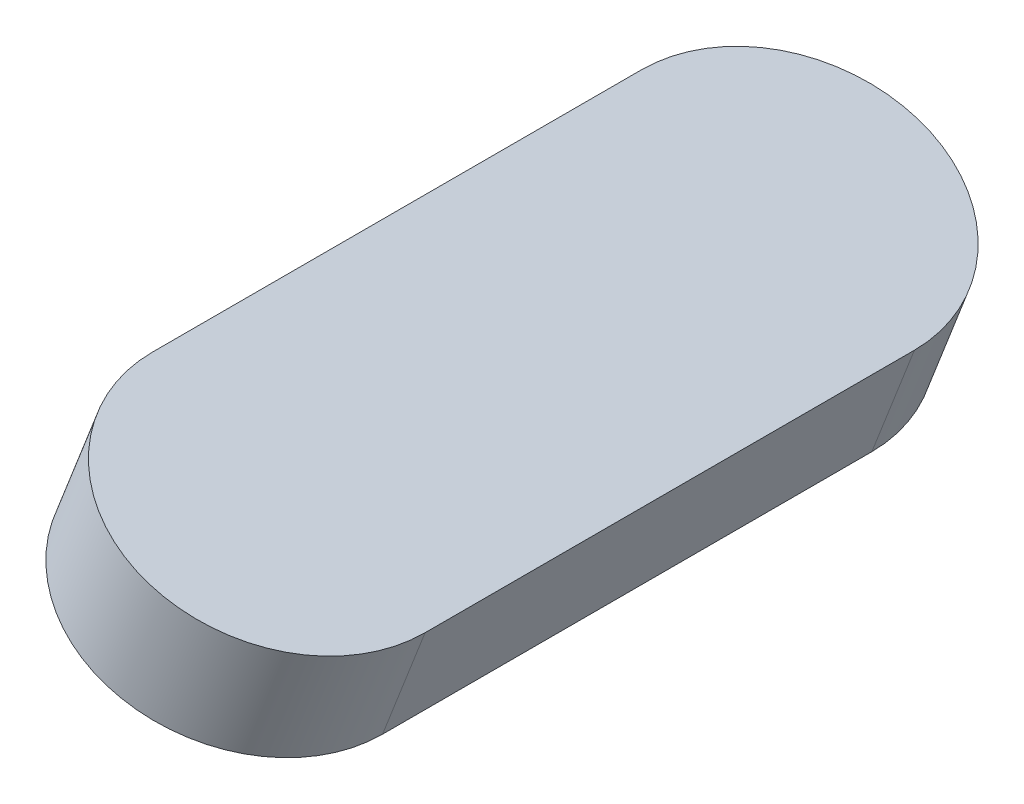
ISO-10303-21;
HEADER;
FILE_DESCRIPTION(('STEP AP214'),'2;1');
FILE_NAME('part.step','',(''),(''),'','','');
FILE_SCHEMA(('AUTOMOTIVE_DESIGN { 1 0 10303 214 1 1 1 1 }'));
ENDSEC;
DATA;
#1=APPLICATION_CONTEXT('core data for automotive mechanical design processes');
#2=APPLICATION_PROTOCOL_DEFINITION('international standard','automotive_design',2000,#1);
#3=PRODUCT_CONTEXT('',#1,'mechanical');
#4=PRODUCT('Part','Part','',(#3));
#5=PRODUCT_RELATED_PRODUCT_CATEGORY('part','',(#4));
#6=PRODUCT_DEFINITION_FORMATION('','',#4);
#7=PRODUCT_DEFINITION_CONTEXT('part definition',#1,'design');
#8=PRODUCT_DEFINITION('design','',#6,#7);
#9=PRODUCT_DEFINITION_SHAPE('','',#8);
#10=(LENGTH_UNIT() NAMED_UNIT(*) SI_UNIT(.MILLI.,.METRE.));
#11=(NAMED_UNIT(*) PLANE_ANGLE_UNIT() SI_UNIT($,.RADIAN.));
#12=(NAMED_UNIT(*) SI_UNIT($,.STERADIAN.) SOLID_ANGLE_UNIT());
#13=UNCERTAINTY_MEASURE_WITH_UNIT(LENGTH_MEASURE(1.E-05),#10,'distance_accuracy_value','');
#14=(GEOMETRIC_REPRESENTATION_CONTEXT(3) GLOBAL_UNCERTAINTY_ASSIGNED_CONTEXT((#13)) GLOBAL_UNIT_ASSIGNED_CONTEXT((#10,
#11,#12)) REPRESENTATION_CONTEXT('',''));
#15=CARTESIAN_POINT('',(0.,0.,0.));
#16=DIRECTION('',(0.,0.,1.));
#17=DIRECTION('',(1.,0.,0.));
#18=AXIS2_PLACEMENT_3D('',#15,#16,#17);
#19=CARTESIAN_POINT('',(-5.2564766926732,-9.70775474646512,37.3656019047525));
#20=DIRECTION('',(-0.363059071754713,-0.931766124312644,0.));
#21=DIRECTION('',(0.931766124312644,-0.363059071754713,0.));
#22=AXIS2_PLACEMENT_3D('',#19,#20,#21);
#23=CYLINDRICAL_SURFACE('',#22,3.17499999999998);
#24=CARTESIAN_POINT('',(-6.17864673493017,-12.0744407022192,37.3656019047525));
#25=DIRECTION('',(0.363059071754713,0.931766124312644,0.));
#26=DIRECTION('',(-0.931766124312644,0.363059071754713,0.));
#27=AXIS2_PLACEMENT_3D('',#24,#25,#26);
#28=CIRCLE('',#27,3.17499999999998);
#29=CARTESIAN_POINT('',(-9.1370041796228,-10.921728149398,37.3656019047525));
#30=VERTEX_POINT('',#29);
#31=CARTESIAN_POINT('',(-3.22028929023755,-13.2271532550404,37.3656019047525));
#32=VERTEX_POINT('',#31);
#33=EDGE_CURVE('E117',#30,#32,#28,.T.);
#34=ORIENTED_EDGE('',*,*,#33,.T.);
#35=DIRECTION('',(-0.363059071754713,-0.931766124312644,0.));
#36=VECTOR('',#35,1.);
#37=CARTESIAN_POINT('',(-2.29811924798058,-10.8604672992863,37.3656019047525));
#38=LINE('',#37,#36);
#39=CARTESIAN_POINT('',(-2.29811924798058,-10.8604672992863,37.3656019047525));
#40=VERTEX_POINT('',#39);
#41=EDGE_CURVE('E12',#40,#32,#38,.T.);
#42=ORIENTED_EDGE('',*,*,#41,.F.);
#43=CARTESIAN_POINT('',(-5.2564766926732,-9.70775474646512,37.3656019047525));
#44=DIRECTION('',(0.363059071754713,0.931766124312644,0.));
#45=DIRECTION('',(-0.931766124312644,0.363059071754713,0.));
#46=AXIS2_PLACEMENT_3D('',#43,#44,#45);
#47=CIRCLE('',#46,3.17499999999998);
#48=CARTESIAN_POINT('',(-8.21483413736583,-8.55504219364392,37.3656019047525));
#49=VERTEX_POINT('',#48);
#50=EDGE_CURVE('E86',#49,#40,#47,.T.);
#51=ORIENTED_EDGE('',*,*,#50,.F.);
#52=DIRECTION('',(-0.363059071754713,-0.931766124312644,0.));
#53=VECTOR('',#52,1.);
#54=CARTESIAN_POINT('',(-8.21483413736583,-8.55504219364392,37.3656019047525));
#55=LINE('',#54,#53);
#56=EDGE_CURVE('E97',#49,#30,#55,.T.);
#57=ORIENTED_EDGE('',*,*,#56,.T.);
#58=EDGE_LOOP('',(#34,#42,#51,#57));
#59=FACE_BOUND('',#58,.T.);
#60=ADVANCED_FACE('F35',(#59),#23,.T.);
#61=CARTESIAN_POINT('',(-2.29811924798058,-10.8604672992863,37.3656019047525));
#62=DIRECTION('',(-0.931766124312644,0.363059071754713,0.));
#63=DIRECTION('',(-0.363059071754713,-0.931766124312644,0.));
#64=AXIS2_PLACEMENT_3D('',#61,#62,#63);
#65=PLANE('',#64);
#66=DIRECTION('',(0.,0.,-1.));
#67=VECTOR('',#66,1.);
#68=CARTESIAN_POINT('',(-3.22028929023755,-13.2271532550404,37.3656019047525));
#69=LINE('',#68,#67);
#70=CARTESIAN_POINT('',(-3.22028929023752,-13.2271532550405,26.7597409836659));
#71=VERTEX_POINT('',#70);
#72=EDGE_CURVE('E91',#32,#71,#69,.T.);
#73=ORIENTED_EDGE('',*,*,#72,.T.);
#74=DIRECTION('',(-0.363059071754713,-0.931766124312644,0.));
#75=VECTOR('',#74,1.);
#76=CARTESIAN_POINT('',(-2.29811924798054,-10.8604672992863,26.7597409836659));
#77=LINE('',#76,#75);
#78=CARTESIAN_POINT('',(-2.29811924798054,-10.8604672992863,26.7597409836659));
#79=VERTEX_POINT('',#78);
#80=EDGE_CURVE('E43',#79,#71,#77,.T.);
#81=ORIENTED_EDGE('',*,*,#80,.F.);
#82=DIRECTION('',(0.,0.,-1.));
#83=VECTOR('',#82,1.);
#84=CARTESIAN_POINT('',(-2.29811924798058,-10.8604672992863,37.3656019047525));
#85=LINE('',#84,#83);
#86=EDGE_CURVE('E81',#40,#79,#85,.T.);
#87=ORIENTED_EDGE('',*,*,#86,.F.);
#88=ORIENTED_EDGE('',*,*,#41,.T.);
#89=EDGE_LOOP('',(#73,#81,#87,#88));
#90=FACE_BOUND('',#89,.T.);
#91=ADVANCED_FACE('F90',(#90),#65,.F.);
#92=CARTESIAN_POINT('',(-5.25647669267314,-9.70775474646515,26.7597409836659));
#93=DIRECTION('',(-0.363059071754713,-0.931766124312644,0.));
#94=DIRECTION('',(0.931766124312644,-0.363059071754713,0.));
#95=AXIS2_PLACEMENT_3D('',#92,#93,#94);
#96=CYLINDRICAL_SURFACE('',#95,3.17499999999994);
#97=CARTESIAN_POINT('',(-6.17864673493011,-12.0744407022193,26.7597409836659));
#98=DIRECTION('',(0.363059071754713,0.931766124312644,0.));
#99=DIRECTION('',(-0.931766124312644,0.363059071754713,0.));
#100=AXIS2_PLACEMENT_3D('',#97,#98,#99);
#101=CIRCLE('',#100,3.17499999999994);
#102=CARTESIAN_POINT('',(-9.13700417962272,-10.9217281493981,26.7597409836659));
#103=VERTEX_POINT('',#102);
#104=EDGE_CURVE('E68',#71,#103,#101,.T.);
#105=ORIENTED_EDGE('',*,*,#104,.T.);
#106=DIRECTION('',(-0.363059071754713,-0.931766124312644,0.));
#107=VECTOR('',#106,1.);
#108=CARTESIAN_POINT('',(-8.21483413736575,-8.55504219364395,26.7597409836659));
#109=LINE('',#108,#107);
#110=CARTESIAN_POINT('',(-8.21483413736575,-8.55504219364395,26.7597409836659));
#111=VERTEX_POINT('',#110);
#112=EDGE_CURVE('E92',#111,#103,#109,.T.);
#113=ORIENTED_EDGE('',*,*,#112,.F.);
#114=CARTESIAN_POINT('',(-5.25647669267314,-9.70775474646515,26.7597409836659));
#115=DIRECTION('',(0.363059071754713,0.931766124312644,0.));
#116=DIRECTION('',(-0.931766124312644,0.363059071754713,0.));
#117=AXIS2_PLACEMENT_3D('',#114,#115,#116);
#118=CIRCLE('',#117,3.17499999999994);
#119=EDGE_CURVE('E84',#79,#111,#118,.T.);
#120=ORIENTED_EDGE('',*,*,#119,.F.);
#121=ORIENTED_EDGE('',*,*,#80,.T.);
#122=EDGE_LOOP('',(#105,#113,#120,#121));
#123=FACE_BOUND('',#122,.T.);
#124=ADVANCED_FACE('F93',(#123),#96,.T.);
#125=CARTESIAN_POINT('',(-8.21483413736575,-8.55504219364395,26.7597409836659));
#126=DIRECTION('',(0.931766124312644,-0.363059071754713,0.));
#127=DIRECTION('',(0.363059071754713,0.931766124312644,0.));
#128=AXIS2_PLACEMENT_3D('',#125,#126,#127);
#129=PLANE('',#128);
#130=DIRECTION('',(0.,0.,1.));
#131=VECTOR('',#130,1.);
#132=CARTESIAN_POINT('',(-9.13700417962272,-10.9217281493981,26.7597409836659));
#133=LINE('',#132,#131);
#134=EDGE_CURVE('E74',#103,#30,#133,.T.);
#135=ORIENTED_EDGE('',*,*,#134,.T.);
#136=ORIENTED_EDGE('',*,*,#56,.F.);
#137=DIRECTION('',(0.,0.,1.));
#138=VECTOR('',#137,1.);
#139=CARTESIAN_POINT('',(-8.21483413736575,-8.55504219364395,26.7597409836659));
#140=LINE('',#139,#138);
#141=EDGE_CURVE('E51',#111,#49,#140,.T.);
#142=ORIENTED_EDGE('',*,*,#141,.F.);
#143=ORIENTED_EDGE('',*,*,#112,.T.);
#144=EDGE_LOOP('',(#135,#136,#142,#143));
#145=FACE_BOUND('',#144,.T.);
#146=ADVANCED_FACE('F112',(#145),#129,.F.);
#147=CARTESIAN_POINT('',(-5.2564766926732,-9.70775474646512,37.3656019047525));
#148=DIRECTION('',(0.363059071754713,0.931766124312644,0.));
#149=DIRECTION('',(-0.931766124312644,0.363059071754713,0.));
#150=AXIS2_PLACEMENT_3D('',#147,#148,#149);
#151=PLANE('',#150);
#152=ORIENTED_EDGE('',*,*,#50,.T.);
#153=ORIENTED_EDGE('',*,*,#86,.T.);
#154=ORIENTED_EDGE('',*,*,#119,.T.);
#155=ORIENTED_EDGE('',*,*,#141,.T.);
#156=EDGE_LOOP('',(#152,#153,#154,#155));
#157=FACE_BOUND('',#156,.T.);
#158=ADVANCED_FACE('F82',(#157),#151,.T.);
#159=CARTESIAN_POINT('',(-6.17864673493017,-12.0744407022192,37.3656019047525));
#160=DIRECTION('',(0.363059071754713,0.931766124312644,0.));
#161=DIRECTION('',(-0.931766124312644,0.363059071754713,0.));
#162=AXIS2_PLACEMENT_3D('',#159,#160,#161);
#163=PLANE('',#162);
#164=ORIENTED_EDGE('',*,*,#33,.F.);
#165=ORIENTED_EDGE('',*,*,#134,.F.);
#166=ORIENTED_EDGE('',*,*,#104,.F.);
#167=ORIENTED_EDGE('',*,*,#72,.F.);
#168=EDGE_LOOP('',(#164,#165,#166,#167));
#169=FACE_BOUND('',#168,.T.);
#170=ADVANCED_FACE('F115',(#169),#163,.F.);
#171=CLOSED_SHELL('',(#60,#91,#124,#146,#158,#170));
#172=MANIFOLD_SOLID_BREP('B2',#171);
#173=ADVANCED_BREP_SHAPE_REPRESENTATION('',(#18,#172),#14);
#174=SHAPE_DEFINITION_REPRESENTATION(#9,#173);
ENDSEC;
END-ISO-10303-21;
